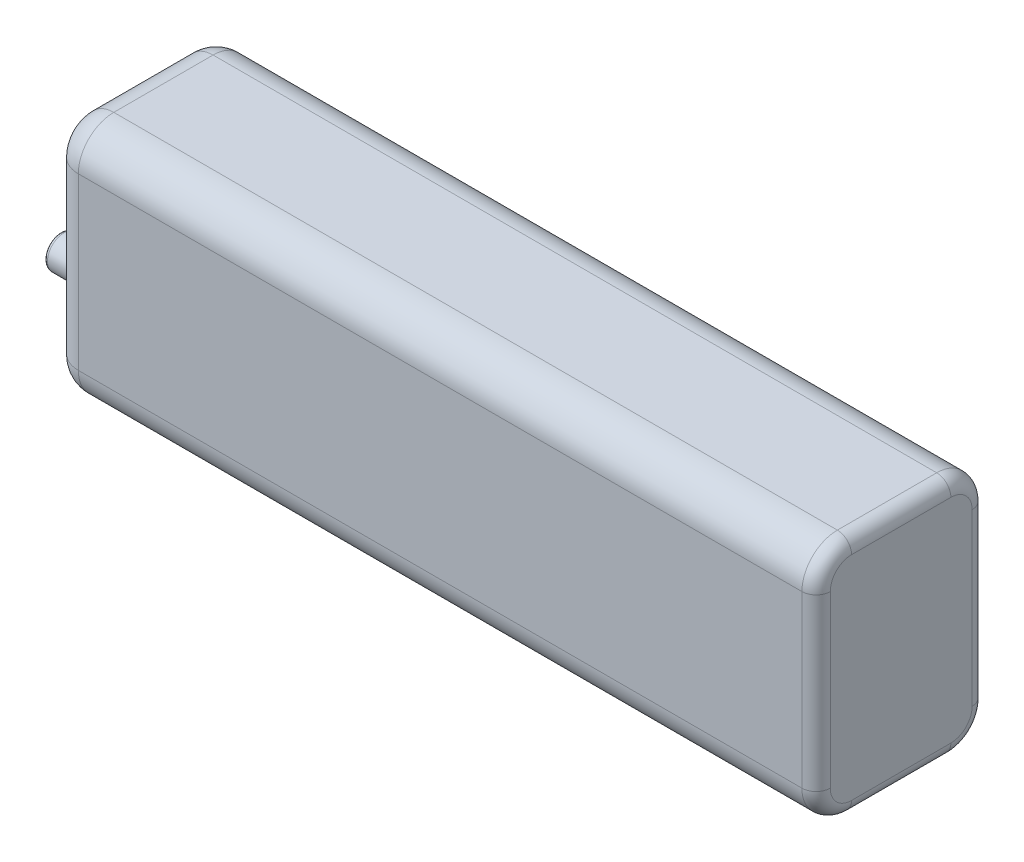
ISO-10303-21;
HEADER;
FILE_DESCRIPTION(('STEP AP214'),'2;1');
FILE_NAME('part.step','',(''),(''),'','','');
FILE_SCHEMA(('AUTOMOTIVE_DESIGN { 1 0 10303 214 1 1 1 1 }'));
ENDSEC;
DATA;
#1=APPLICATION_CONTEXT('core data for automotive mechanical design processes');
#2=APPLICATION_PROTOCOL_DEFINITION('international standard','automotive_design',2000,#1);
#3=PRODUCT_CONTEXT('',#1,'mechanical');
#4=PRODUCT('Part','Part','',(#3));
#5=PRODUCT_RELATED_PRODUCT_CATEGORY('part','',(#4));
#6=PRODUCT_DEFINITION_FORMATION('','',#4);
#7=PRODUCT_DEFINITION_CONTEXT('part definition',#1,'design');
#8=PRODUCT_DEFINITION('design','',#6,#7);
#9=PRODUCT_DEFINITION_SHAPE('','',#8);
#10=(LENGTH_UNIT() NAMED_UNIT(*) SI_UNIT(.MILLI.,.METRE.));
#11=(NAMED_UNIT(*) PLANE_ANGLE_UNIT() SI_UNIT($,.RADIAN.));
#12=(NAMED_UNIT(*) SI_UNIT($,.STERADIAN.) SOLID_ANGLE_UNIT());
#13=UNCERTAINTY_MEASURE_WITH_UNIT(LENGTH_MEASURE(1.E-05),#10,'distance_accuracy_value','');
#14=(GEOMETRIC_REPRESENTATION_CONTEXT(3) GLOBAL_UNCERTAINTY_ASSIGNED_CONTEXT((#13)) GLOBAL_UNIT_ASSIGNED_CONTEXT((#10,
#11,#12)) REPRESENTATION_CONTEXT('',''));
#15=CARTESIAN_POINT('',(0.,0.,0.));
#16=DIRECTION('',(0.,0.,1.));
#17=DIRECTION('',(1.,0.,0.));
#18=AXIS2_PLACEMENT_3D('',#15,#16,#17);
#19=CARTESIAN_POINT('',(-54.,17.,24.));
#20=DIRECTION('',(1.,0.,0.));
#21=DIRECTION('',(0.,1.,0.));
#22=AXIS2_PLACEMENT_3D('',#19,#20,#21);
#23=PLANE('',#22);
#24=DIRECTION('',(0.,-1.,0.));
#25=VECTOR('',#24,1.);
#26=CARTESIAN_POINT('',(-54.,12.,20.));
#27=LINE('',#26,#25);
#28=CARTESIAN_POINT('',(-54.,-12.,20.));
#29=VERTEX_POINT('',#28);
#30=CARTESIAN_POINT('',(-54.,12.,20.));
#31=VERTEX_POINT('',#30);
#32=EDGE_CURVE('E288',#29,#31,#27,.F.);
#33=ORIENTED_EDGE('',*,*,#32,.T.);
#34=CARTESIAN_POINT('',(-54.,12.,19.));
#35=DIRECTION('',(1.,0.,0.));
#36=DIRECTION('',(0.,1.,0.));
#37=AXIS2_PLACEMENT_3D('',#34,#35,#36);
#38=CIRCLE('',#37,1.);
#39=CARTESIAN_POINT('',(-54.,13.,19.));
#40=VERTEX_POINT('',#39);
#41=EDGE_CURVE('E312',#31,#40,#38,.F.);
#42=ORIENTED_EDGE('',*,*,#41,.T.);
#43=DIRECTION('',(0.,0.,-1.));
#44=VECTOR('',#43,1.);
#45=CARTESIAN_POINT('',(-54.,13.,24.));
#46=LINE('',#45,#44);
#47=CARTESIAN_POINT('',(-54.,13.,5.));
#48=VERTEX_POINT('',#47);
#49=EDGE_CURVE('E310',#40,#48,#46,.T.);
#50=ORIENTED_EDGE('',*,*,#49,.T.);
#51=CARTESIAN_POINT('',(-54.,12.,5.));
#52=DIRECTION('',(1.,0.,0.));
#53=DIRECTION('',(0.,1.,0.));
#54=AXIS2_PLACEMENT_3D('',#51,#52,#53);
#55=CIRCLE('',#54,1.);
#56=CARTESIAN_POINT('',(-54.,12.,4.));
#57=VERTEX_POINT('',#56);
#58=EDGE_CURVE('E308',#48,#57,#55,.F.);
#59=ORIENTED_EDGE('',*,*,#58,.T.);
#60=DIRECTION('',(0.,-1.,0.));
#61=VECTOR('',#60,1.);
#62=CARTESIAN_POINT('',(-54.,17.,4.));
#63=LINE('',#62,#61);
#64=CARTESIAN_POINT('',(-54.,-12.,4.));
#65=VERTEX_POINT('',#64);
#66=EDGE_CURVE('E306',#57,#65,#63,.T.);
#67=ORIENTED_EDGE('',*,*,#66,.T.);
#68=CARTESIAN_POINT('',(-54.,-12.,5.));
#69=DIRECTION('',(1.,0.,0.));
#70=DIRECTION('',(0.,1.,0.));
#71=AXIS2_PLACEMENT_3D('',#68,#69,#70);
#72=CIRCLE('',#71,1.);
#73=CARTESIAN_POINT('',(-54.,-13.,5.));
#74=VERTEX_POINT('',#73);
#75=EDGE_CURVE('E304',#65,#74,#72,.F.);
#76=ORIENTED_EDGE('',*,*,#75,.T.);
#77=DIRECTION('',(0.,0.,-1.));
#78=VECTOR('',#77,1.);
#79=CARTESIAN_POINT('',(-54.,-13.,24.));
#80=LINE('',#79,#78);
#81=CARTESIAN_POINT('',(-54.,-13.,19.));
#82=VERTEX_POINT('',#81);
#83=EDGE_CURVE('E302',#74,#82,#80,.F.);
#84=ORIENTED_EDGE('',*,*,#83,.T.);
#85=CARTESIAN_POINT('',(-54.,-12.,19.));
#86=DIRECTION('',(1.,0.,0.));
#87=DIRECTION('',(0.,1.,0.));
#88=AXIS2_PLACEMENT_3D('',#85,#86,#87);
#89=CIRCLE('',#88,1.);
#90=EDGE_CURVE('E300',#82,#29,#89,.F.);
#91=ORIENTED_EDGE('',*,*,#90,.T.);
#92=EDGE_LOOP('',(#33,#42,#50,#59,#67,#76,#84,#91));
#93=FACE_BOUND('',#92,.T.);
#94=DIRECTION('',(0.,1.,0.));
#95=VECTOR('',#94,1.);
#96=CARTESIAN_POINT('',(-54.,-3.71623294333291,17.6228811895128));
#97=LINE('',#96,#95);
#98=CARTESIAN_POINT('',(-54.,-12.0863039057049,17.6228811895128));
#99=VERTEX_POINT('',#98);
#100=CARTESIAN_POINT('',(-54.,-3.71623294333291,17.6228811895128));
#101=VERTEX_POINT('',#100);
#102=EDGE_CURVE('E201',#99,#101,#97,.T.);
#103=ORIENTED_EDGE('',*,*,#102,.F.);
#104=DIRECTION('',(0.,0.,1.));
#105=VECTOR('',#104,1.);
#106=CARTESIAN_POINT('',(-54.,-12.0863039057049,17.6228811895128));
#107=LINE('',#106,#105);
#108=CARTESIAN_POINT('',(-54.,-12.0863039057049,5.6695768500166));
#109=VERTEX_POINT('',#108);
#110=EDGE_CURVE('E208',#109,#99,#107,.T.);
#111=ORIENTED_EDGE('',*,*,#110,.F.);
#112=DIRECTION('',(0.,-1.,0.));
#113=VECTOR('',#112,1.);
#114=CARTESIAN_POINT('',(-54.,-3.71623294333291,5.6695768500166));
#115=LINE('',#114,#113);
#116=CARTESIAN_POINT('',(-54.,-3.71623294333291,5.6695768500166));
#117=VERTEX_POINT('',#116);
#118=EDGE_CURVE('E221',#117,#109,#115,.T.);
#119=ORIENTED_EDGE('',*,*,#118,.F.);
#120=DIRECTION('',(0.,0.,-1.));
#121=VECTOR('',#120,1.);
#122=CARTESIAN_POINT('',(-54.,-3.71623294333291,17.6228811895128));
#123=LINE('',#122,#121);
#124=EDGE_CURVE('E216',#101,#117,#123,.T.);
#125=ORIENTED_EDGE('',*,*,#124,.F.);
#126=EDGE_LOOP('',(#103,#111,#119,#125));
#127=FACE_BOUND('',#126,.T.);
#128=ADVANCED_FACE('F41',(#93,#127),#23,.F.);
#129=CARTESIAN_POINT('',(54.,17.,24.));
#130=DIRECTION('',(-1.,0.,0.));
#131=DIRECTION('',(0.,-1.,0.));
#132=AXIS2_PLACEMENT_3D('',#129,#130,#131);
#133=PLANE('',#132);
#134=DIRECTION('',(0.,1.,0.));
#135=VECTOR('',#134,1.);
#136=CARTESIAN_POINT('',(54.,-12.,22.));
#137=LINE('',#136,#135);
#138=CARTESIAN_POINT('',(54.,12.,22.));
#139=VERTEX_POINT('',#138);
#140=CARTESIAN_POINT('',(54.,-12.,22.));
#141=VERTEX_POINT('',#140);
#142=EDGE_CURVE('E335',#139,#141,#137,.F.);
#143=ORIENTED_EDGE('',*,*,#142,.T.);
#144=CARTESIAN_POINT('',(54.,-12.,19.));
#145=DIRECTION('',(-1.,0.,0.));
#146=DIRECTION('',(0.,-1.,0.));
#147=AXIS2_PLACEMENT_3D('',#144,#145,#146);
#148=CIRCLE('',#147,3.);
#149=CARTESIAN_POINT('',(54.,-15.,19.));
#150=VERTEX_POINT('',#149);
#151=EDGE_CURVE('E371',#141,#150,#148,.F.);
#152=ORIENTED_EDGE('',*,*,#151,.T.);
#153=DIRECTION('',(0.,0.,-1.));
#154=VECTOR('',#153,1.);
#155=CARTESIAN_POINT('',(54.,-15.,24.));
#156=LINE('',#155,#154);
#157=CARTESIAN_POINT('',(54.,-15.,5.));
#158=VERTEX_POINT('',#157);
#159=EDGE_CURVE('E369',#150,#158,#156,.T.);
#160=ORIENTED_EDGE('',*,*,#159,.T.);
#161=CARTESIAN_POINT('',(54.,-12.,5.));
#162=DIRECTION('',(-1.,0.,0.));
#163=DIRECTION('',(0.,-1.,0.));
#164=AXIS2_PLACEMENT_3D('',#161,#162,#163);
#165=CIRCLE('',#164,3.);
#166=CARTESIAN_POINT('',(54.,-12.,2.));
#167=VERTEX_POINT('',#166);
#168=EDGE_CURVE('E367',#158,#167,#165,.F.);
#169=ORIENTED_EDGE('',*,*,#168,.T.);
#170=DIRECTION('',(0.,1.,0.));
#171=VECTOR('',#170,1.);
#172=CARTESIAN_POINT('',(54.,17.,2.));
#173=LINE('',#172,#171);
#174=CARTESIAN_POINT('',(54.,12.,2.));
#175=VERTEX_POINT('',#174);
#176=EDGE_CURVE('E365',#167,#175,#173,.T.);
#177=ORIENTED_EDGE('',*,*,#176,.T.);
#178=CARTESIAN_POINT('',(54.,12.,5.));
#179=DIRECTION('',(-1.,0.,0.));
#180=DIRECTION('',(0.,-1.,0.));
#181=AXIS2_PLACEMENT_3D('',#178,#179,#180);
#182=CIRCLE('',#181,3.);
#183=CARTESIAN_POINT('',(54.,15.,5.));
#184=VERTEX_POINT('',#183);
#185=EDGE_CURVE('E363',#175,#184,#182,.F.);
#186=ORIENTED_EDGE('',*,*,#185,.T.);
#187=DIRECTION('',(0.,0.,-1.));
#188=VECTOR('',#187,1.);
#189=CARTESIAN_POINT('',(54.,15.,24.));
#190=LINE('',#189,#188);
#191=CARTESIAN_POINT('',(54.,15.,19.));
#192=VERTEX_POINT('',#191);
#193=EDGE_CURVE('E361',#184,#192,#190,.F.);
#194=ORIENTED_EDGE('',*,*,#193,.T.);
#195=CARTESIAN_POINT('',(54.,12.,19.));
#196=DIRECTION('',(-1.,0.,0.));
#197=DIRECTION('',(0.,-1.,0.));
#198=AXIS2_PLACEMENT_3D('',#195,#196,#197);
#199=CIRCLE('',#198,3.);
#200=EDGE_CURVE('E359',#192,#139,#199,.F.);
#201=ORIENTED_EDGE('',*,*,#200,.T.);
#202=EDGE_LOOP('',(#143,#152,#160,#169,#177,#186,#194,#201));
#203=FACE_BOUND('',#202,.T.);
#204=ADVANCED_FACE('F484',(#203),#133,.F.);
#205=CARTESIAN_POINT('',(-54.,17.,24.));
#206=DIRECTION('',(0.,-1.,0.));
#207=DIRECTION('',(0.,0.,-1.));
#208=AXIS2_PLACEMENT_3D('',#205,#206,#207);
#209=PLANE('',#208);
#210=DIRECTION('',(-1.,0.,0.));
#211=VECTOR('',#210,1.);
#212=CARTESIAN_POINT('',(54.,17.,19.));
#213=LINE('',#212,#211);
#214=CARTESIAN_POINT('',(-50.,17.,19.));
#215=VERTEX_POINT('',#214);
#216=CARTESIAN_POINT('',(52.,17.,19.));
#217=VERTEX_POINT('',#216);
#218=EDGE_CURVE('E231',#215,#217,#213,.F.);
#219=ORIENTED_EDGE('',*,*,#218,.T.);
#220=DIRECTION('',(0.,0.,-1.));
#221=VECTOR('',#220,1.);
#222=CARTESIAN_POINT('',(52.,17.,24.));
#223=LINE('',#222,#221);
#224=CARTESIAN_POINT('',(52.,17.,5.));
#225=VERTEX_POINT('',#224);
#226=EDGE_CURVE('E385',#217,#225,#223,.T.);
#227=ORIENTED_EDGE('',*,*,#226,.T.);
#228=DIRECTION('',(-1.,0.,0.));
#229=VECTOR('',#228,1.);
#230=CARTESIAN_POINT('',(-54.,17.,5.));
#231=LINE('',#230,#229);
#232=CARTESIAN_POINT('',(-50.,17.,5.));
#233=VERTEX_POINT('',#232);
#234=EDGE_CURVE('E233',#225,#233,#231,.T.);
#235=ORIENTED_EDGE('',*,*,#234,.T.);
#236=DIRECTION('',(0.,0.,-1.));
#237=VECTOR('',#236,1.);
#238=CARTESIAN_POINT('',(-50.,17.,24.));
#239=LINE('',#238,#237);
#240=EDGE_CURVE('E318',#233,#215,#239,.F.);
#241=ORIENTED_EDGE('',*,*,#240,.T.);
#242=EDGE_LOOP('',(#219,#227,#235,#241));
#243=FACE_BOUND('',#242,.T.);
#244=ADVANCED_FACE('F443',(#243),#209,.F.);
#245=CARTESIAN_POINT('',(-54.,-17.,24.));
#246=DIRECTION('',(0.,1.,0.));
#247=DIRECTION('',(0.,0.,1.));
#248=AXIS2_PLACEMENT_3D('',#245,#246,#247);
#249=PLANE('',#248);
#250=DIRECTION('',(1.,0.,0.));
#251=VECTOR('',#250,1.);
#252=CARTESIAN_POINT('',(-54.,-17.,5.));
#253=LINE('',#252,#251);
#254=CARTESIAN_POINT('',(-50.,-17.,5.));
#255=VERTEX_POINT('',#254);
#256=CARTESIAN_POINT('',(52.,-17.,5.));
#257=VERTEX_POINT('',#256);
#258=EDGE_CURVE('E246',#255,#257,#253,.T.);
#259=ORIENTED_EDGE('',*,*,#258,.T.);
#260=DIRECTION('',(0.,0.,-1.));
#261=VECTOR('',#260,1.);
#262=CARTESIAN_POINT('',(52.,-17.,24.));
#263=LINE('',#262,#261);
#264=CARTESIAN_POINT('',(52.,-17.,19.));
#265=VERTEX_POINT('',#264);
#266=EDGE_CURVE('E377',#257,#265,#263,.F.);
#267=ORIENTED_EDGE('',*,*,#266,.T.);
#268=DIRECTION('',(1.,0.,0.));
#269=VECTOR('',#268,1.);
#270=CARTESIAN_POINT('',(-54.,-17.,19.));
#271=LINE('',#270,#269);
#272=CARTESIAN_POINT('',(-50.,-17.,19.));
#273=VERTEX_POINT('',#272);
#274=EDGE_CURVE('E244',#265,#273,#271,.F.);
#275=ORIENTED_EDGE('',*,*,#274,.T.);
#276=DIRECTION('',(0.,0.,-1.));
#277=VECTOR('',#276,1.);
#278=CARTESIAN_POINT('',(-50.,-17.,24.));
#279=LINE('',#278,#277);
#280=EDGE_CURVE('E328',#273,#255,#279,.T.);
#281=ORIENTED_EDGE('',*,*,#280,.T.);
#282=EDGE_LOOP('',(#259,#267,#275,#281));
#283=FACE_BOUND('',#282,.T.);
#284=ADVANCED_FACE('F473',(#283),#249,.F.);
#285=CARTESIAN_POINT('',(0.,0.,24.));
#286=DIRECTION('',(0.,0.,1.));
#287=DIRECTION('',(1.,0.,0.));
#288=AXIS2_PLACEMENT_3D('',#285,#286,#287);
#289=PLANE('',#288);
#290=DIRECTION('',(1.,0.,0.));
#291=VECTOR('',#290,1.);
#292=CARTESIAN_POINT('',(54.,-12.,24.));
#293=LINE('',#292,#291);
#294=CARTESIAN_POINT('',(-50.,-12.,24.));
#295=VERTEX_POINT('',#294);
#296=CARTESIAN_POINT('',(52.,-12.,24.));
#297=VERTEX_POINT('',#296);
#298=EDGE_CURVE('E240',#295,#297,#293,.T.);
#299=ORIENTED_EDGE('',*,*,#298,.T.);
#300=DIRECTION('',(0.,1.,0.));
#301=VECTOR('',#300,1.);
#302=CARTESIAN_POINT('',(52.,12.,24.));
#303=LINE('',#302,#301);
#304=CARTESIAN_POINT('',(52.,12.,24.));
#305=VERTEX_POINT('',#304);
#306=EDGE_CURVE('E11',#297,#305,#303,.T.);
#307=ORIENTED_EDGE('',*,*,#306,.T.);
#308=DIRECTION('',(-1.,0.,0.));
#309=VECTOR('',#308,1.);
#310=CARTESIAN_POINT('',(-54.,12.,24.));
#311=LINE('',#310,#309);
#312=CARTESIAN_POINT('',(-50.,12.,24.));
#313=VERTEX_POINT('',#312);
#314=EDGE_CURVE('E242',#305,#313,#311,.T.);
#315=ORIENTED_EDGE('',*,*,#314,.T.);
#316=DIRECTION('',(0.,-1.,0.));
#317=VECTOR('',#316,1.);
#318=CARTESIAN_POINT('',(-50.,-12.,24.));
#319=LINE('',#318,#317);
#320=EDGE_CURVE('E333',#313,#295,#319,.T.);
#321=ORIENTED_EDGE('',*,*,#320,.T.);
#322=EDGE_LOOP('',(#299,#307,#315,#321));
#323=FACE_BOUND('',#322,.T.);
#324=ADVANCED_FACE('F456',(#323),#289,.T.);
#325=CARTESIAN_POINT('',(0.,0.,0.));
#326=DIRECTION('',(0.,0.,1.));
#327=DIRECTION('',(1.,0.,0.));
#328=AXIS2_PLACEMENT_3D('',#325,#326,#327);
#329=PLANE('',#328);
#330=DIRECTION('',(-1.,0.,0.));
#331=VECTOR('',#330,1.);
#332=CARTESIAN_POINT('',(0.,12.,0.));
#333=LINE('',#332,#331);
#334=CARTESIAN_POINT('',(-50.,12.,0.));
#335=VERTEX_POINT('',#334);
#336=CARTESIAN_POINT('',(52.,12.,0.));
#337=VERTEX_POINT('',#336);
#338=EDGE_CURVE('E237',#335,#337,#333,.F.);
#339=ORIENTED_EDGE('',*,*,#338,.T.);
#340=DIRECTION('',(0.,1.,0.));
#341=VECTOR('',#340,1.);
#342=CARTESIAN_POINT('',(52.,0.,0.));
#343=LINE('',#342,#341);
#344=CARTESIAN_POINT('',(52.,-12.,0.));
#345=VERTEX_POINT('',#344);
#346=EDGE_CURVE('E381',#337,#345,#343,.F.);
#347=ORIENTED_EDGE('',*,*,#346,.T.);
#348=DIRECTION('',(1.,0.,0.));
#349=VECTOR('',#348,1.);
#350=CARTESIAN_POINT('',(0.,-12.,0.));
#351=LINE('',#350,#349);
#352=CARTESIAN_POINT('',(-50.,-12.,0.));
#353=VERTEX_POINT('',#352);
#354=EDGE_CURVE('E235',#345,#353,#351,.F.);
#355=ORIENTED_EDGE('',*,*,#354,.T.);
#356=DIRECTION('',(0.,-1.,0.));
#357=VECTOR('',#356,1.);
#358=CARTESIAN_POINT('',(-50.,0.,0.));
#359=LINE('',#358,#357);
#360=EDGE_CURVE('E323',#353,#335,#359,.F.);
#361=ORIENTED_EDGE('',*,*,#360,.T.);
#362=EDGE_LOOP('',(#339,#347,#355,#361));
#363=FACE_BOUND('',#362,.T.);
#364=ADVANCED_FACE('F425',(#363),#329,.F.);
#365=CARTESIAN_POINT('',(-54.,12.,5.));
#366=DIRECTION('',(-1.,0.,0.));
#367=DIRECTION('',(0.,0.,1.));
#368=AXIS2_PLACEMENT_3D('',#365,#366,#367);
#369=CYLINDRICAL_SURFACE('',#368,5.);
#370=ORIENTED_EDGE('',*,*,#234,.F.);
#371=CARTESIAN_POINT('',(52.,12.,5.));
#372=DIRECTION('',(-1.,0.,0.));
#373=DIRECTION('',(0.,-1.,0.));
#374=AXIS2_PLACEMENT_3D('',#371,#372,#373);
#375=CIRCLE('',#374,5.);
#376=EDGE_CURVE('E383',#225,#337,#375,.T.);
#377=ORIENTED_EDGE('',*,*,#376,.T.);
#378=ORIENTED_EDGE('',*,*,#338,.F.);
#379=CARTESIAN_POINT('',(-50.,12.,5.));
#380=DIRECTION('',(1.,0.,0.));
#381=DIRECTION('',(0.,1.,0.));
#382=AXIS2_PLACEMENT_3D('',#379,#380,#381);
#383=CIRCLE('',#382,5.);
#384=EDGE_CURVE('E320',#335,#233,#383,.T.);
#385=ORIENTED_EDGE('',*,*,#384,.T.);
#386=EDGE_LOOP('',(#370,#377,#378,#385));
#387=FACE_BOUND('',#386,.T.);
#388=ADVANCED_FACE('F422',(#387),#369,.T.);
#389=CARTESIAN_POINT('',(0.,12.,19.));
#390=DIRECTION('',(1.,0.,0.));
#391=DIRECTION('',(0.,0.,-1.));
#392=AXIS2_PLACEMENT_3D('',#389,#390,#391);
#393=CYLINDRICAL_SURFACE('',#392,5.);
#394=ORIENTED_EDGE('',*,*,#314,.F.);
#395=CARTESIAN_POINT('',(52.,12.,19.));
#396=DIRECTION('',(-1.,0.,0.));
#397=DIRECTION('',(0.,-1.,0.));
#398=AXIS2_PLACEMENT_3D('',#395,#396,#397);
#399=CIRCLE('',#398,5.);
#400=EDGE_CURVE('E50',#305,#217,#399,.T.);
#401=ORIENTED_EDGE('',*,*,#400,.T.);
#402=ORIENTED_EDGE('',*,*,#218,.F.);
#403=CARTESIAN_POINT('',(-50.,12.,19.));
#404=DIRECTION('',(1.,0.,0.));
#405=DIRECTION('',(0.,1.,0.));
#406=AXIS2_PLACEMENT_3D('',#403,#404,#405);
#407=CIRCLE('',#406,5.);
#408=EDGE_CURVE('E315',#215,#313,#407,.T.);
#409=ORIENTED_EDGE('',*,*,#408,.T.);
#410=EDGE_LOOP('',(#394,#401,#402,#409));
#411=FACE_BOUND('',#410,.T.);
#412=ADVANCED_FACE('F445',(#411),#393,.T.);
#413=CARTESIAN_POINT('',(-54.,-12.,5.));
#414=DIRECTION('',(1.,0.,0.));
#415=DIRECTION('',(0.,0.,-1.));
#416=AXIS2_PLACEMENT_3D('',#413,#414,#415);
#417=CYLINDRICAL_SURFACE('',#416,5.);
#418=ORIENTED_EDGE('',*,*,#354,.F.);
#419=CARTESIAN_POINT('',(52.,-12.,5.));
#420=DIRECTION('',(-1.,0.,0.));
#421=DIRECTION('',(0.,-1.,0.));
#422=AXIS2_PLACEMENT_3D('',#419,#420,#421);
#423=CIRCLE('',#422,5.);
#424=EDGE_CURVE('E379',#345,#257,#423,.T.);
#425=ORIENTED_EDGE('',*,*,#424,.T.);
#426=ORIENTED_EDGE('',*,*,#258,.F.);
#427=CARTESIAN_POINT('',(-50.,-12.,5.));
#428=DIRECTION('',(1.,0.,0.));
#429=DIRECTION('',(0.,1.,0.));
#430=AXIS2_PLACEMENT_3D('',#427,#428,#429);
#431=CIRCLE('',#430,5.);
#432=EDGE_CURVE('E325',#255,#353,#431,.T.);
#433=ORIENTED_EDGE('',*,*,#432,.T.);
#434=EDGE_LOOP('',(#418,#425,#426,#433));
#435=FACE_BOUND('',#434,.T.);
#436=ADVANCED_FACE('F477',(#435),#417,.T.);
#437=CARTESIAN_POINT('',(0.,-12.,19.));
#438=DIRECTION('',(-1.,0.,0.));
#439=DIRECTION('',(0.,0.,1.));
#440=AXIS2_PLACEMENT_3D('',#437,#438,#439);
#441=CYLINDRICAL_SURFACE('',#440,5.);
#442=ORIENTED_EDGE('',*,*,#274,.F.);
#443=CARTESIAN_POINT('',(52.,-12.,19.));
#444=DIRECTION('',(-1.,0.,0.));
#445=DIRECTION('',(0.,-1.,0.));
#446=AXIS2_PLACEMENT_3D('',#443,#444,#445);
#447=CIRCLE('',#446,5.);
#448=EDGE_CURVE('E374',#265,#297,#447,.T.);
#449=ORIENTED_EDGE('',*,*,#448,.T.);
#450=ORIENTED_EDGE('',*,*,#298,.F.);
#451=CARTESIAN_POINT('',(-50.,-12.,19.));
#452=DIRECTION('',(1.,0.,0.));
#453=DIRECTION('',(0.,1.,0.));
#454=AXIS2_PLACEMENT_3D('',#451,#452,#453);
#455=CIRCLE('',#454,5.);
#456=EDGE_CURVE('E330',#295,#273,#455,.T.);
#457=ORIENTED_EDGE('',*,*,#456,.T.);
#458=EDGE_LOOP('',(#442,#449,#450,#457));
#459=FACE_BOUND('',#458,.T.);
#460=ADVANCED_FACE('F460',(#459),#441,.T.);
#461=CARTESIAN_POINT('',(-57.,-3.71623294333291,17.6228811895128));
#462=DIRECTION('',(0.,0.,-1.));
#463=DIRECTION('',(-1.,0.,0.));
#464=AXIS2_PLACEMENT_3D('',#461,#462,#463);
#465=PLANE('',#464);
#466=DIRECTION('',(1.,0.,0.));
#467=VECTOR('',#466,1.);
#468=CARTESIAN_POINT('',(-57.,-3.71623294333291,17.6228811895128));
#469=LINE('',#468,#467);
#470=CARTESIAN_POINT('',(-56.,-3.71623294333291,17.6228811895128));
#471=VERTEX_POINT('',#470);
#472=EDGE_CURVE('E229',#471,#101,#469,.T.);
#473=ORIENTED_EDGE('',*,*,#472,.F.);
#474=DIRECTION('',(0.,-1.,0.));
#475=VECTOR('',#474,1.);
#476=CARTESIAN_POINT('',(-56.,-3.71623294333291,17.6228811895128));
#477=LINE('',#476,#475);
#478=CARTESIAN_POINT('',(-56.,-12.0863039057049,17.6228811895128));
#479=VERTEX_POINT('',#478);
#480=EDGE_CURVE('E203',#471,#479,#477,.T.);
#481=ORIENTED_EDGE('',*,*,#480,.T.);
#482=DIRECTION('',(1.,0.,0.));
#483=VECTOR('',#482,1.);
#484=CARTESIAN_POINT('',(-57.,-12.0863039057049,17.6228811895128));
#485=LINE('',#484,#483);
#486=EDGE_CURVE('E197',#479,#99,#485,.T.);
#487=ORIENTED_EDGE('',*,*,#486,.T.);
#488=ORIENTED_EDGE('',*,*,#102,.T.);
#489=EDGE_LOOP('',(#473,#481,#487,#488));
#490=FACE_BOUND('',#489,.T.);
#491=ADVANCED_FACE('F200',(#490),#465,.F.);
#492=CARTESIAN_POINT('',(-57.,-3.71623294333291,17.6228811895128));
#493=DIRECTION('',(0.,-1.,0.));
#494=DIRECTION('',(1.,0.,0.));
#495=AXIS2_PLACEMENT_3D('',#492,#493,#494);
#496=PLANE('',#495);
#497=DIRECTION('',(1.,0.,0.));
#498=VECTOR('',#497,1.);
#499=CARTESIAN_POINT('',(-57.,-3.71623294333291,5.6695768500166));
#500=LINE('',#499,#498);
#501=CARTESIAN_POINT('',(-56.,-3.71623294333291,5.6695768500166));
#502=VERTEX_POINT('',#501);
#503=EDGE_CURVE('E227',#502,#117,#500,.T.);
#504=ORIENTED_EDGE('',*,*,#503,.F.);
#505=DIRECTION('',(0.,0.,1.));
#506=VECTOR('',#505,1.);
#507=CARTESIAN_POINT('',(-56.,-3.71623294333291,17.6228811895128));
#508=LINE('',#507,#506);
#509=EDGE_CURVE('E278',#502,#471,#508,.T.);
#510=ORIENTED_EDGE('',*,*,#509,.T.);
#511=ORIENTED_EDGE('',*,*,#472,.T.);
#512=ORIENTED_EDGE('',*,*,#124,.T.);
#513=EDGE_LOOP('',(#504,#510,#511,#512));
#514=FACE_BOUND('',#513,.T.);
#515=ADVANCED_FACE('F684',(#514),#496,.F.);
#516=CARTESIAN_POINT('',(-57.,-3.71623294333291,5.6695768500166));
#517=DIRECTION('',(0.,0.,1.));
#518=DIRECTION('',(0.,-1.,0.));
#519=AXIS2_PLACEMENT_3D('',#516,#517,#518);
#520=PLANE('',#519);
#521=DIRECTION('',(1.,0.,0.));
#522=VECTOR('',#521,1.);
#523=CARTESIAN_POINT('',(-57.,-12.0863039057049,5.6695768500166));
#524=LINE('',#523,#522);
#525=CARTESIAN_POINT('',(-56.,-12.0863039057049,5.6695768500166));
#526=VERTEX_POINT('',#525);
#527=EDGE_CURVE('E207',#526,#109,#524,.T.);
#528=ORIENTED_EDGE('',*,*,#527,.F.);
#529=DIRECTION('',(0.,1.,0.));
#530=VECTOR('',#529,1.);
#531=CARTESIAN_POINT('',(-56.,-3.71623294333291,5.6695768500166));
#532=LINE('',#531,#530);
#533=EDGE_CURVE('E281',#526,#502,#532,.T.);
#534=ORIENTED_EDGE('',*,*,#533,.T.);
#535=ORIENTED_EDGE('',*,*,#503,.T.);
#536=ORIENTED_EDGE('',*,*,#118,.T.);
#537=EDGE_LOOP('',(#528,#534,#535,#536));
#538=FACE_BOUND('',#537,.T.);
#539=ADVANCED_FACE('F677',(#538),#520,.F.);
#540=CARTESIAN_POINT('',(-57.,-12.0863039057049,17.6228811895128));
#541=DIRECTION('',(0.,1.,0.));
#542=DIRECTION('',(-1.,0.,0.));
#543=AXIS2_PLACEMENT_3D('',#540,#541,#542);
#544=PLANE('',#543);
#545=ORIENTED_EDGE('',*,*,#486,.F.);
#546=DIRECTION('',(0.,0.,-1.));
#547=VECTOR('',#546,1.);
#548=CARTESIAN_POINT('',(-56.,-12.0863039057049,17.6228811895128));
#549=LINE('',#548,#547);
#550=EDGE_CURVE('E283',#479,#526,#549,.T.);
#551=ORIENTED_EDGE('',*,*,#550,.T.);
#552=ORIENTED_EDGE('',*,*,#527,.T.);
#553=ORIENTED_EDGE('',*,*,#110,.T.);
#554=EDGE_LOOP('',(#545,#551,#552,#553));
#555=FACE_BOUND('',#554,.T.);
#556=ADVANCED_FACE('F219',(#555),#544,.F.);
#557=CARTESIAN_POINT('',(-57.,0.,0.));
#558=DIRECTION('',(1.,0.,0.));
#559=DIRECTION('',(0.,0.,-1.));
#560=AXIS2_PLACEMENT_3D('',#557,#558,#559);
#561=PLANE('',#560);
#562=CARTESIAN_POINT('',(-57.,-8.03150117411007,9.05036894538525));
#563=DIRECTION('',(1.,0.,0.));
#564=DIRECTION('',(0.,0.,-1.));
#565=AXIS2_PLACEMENT_3D('',#562,#563,#564);
#566=CIRCLE('',#565,2.33169499833651);
#567=CARTESIAN_POINT('',(-57.,-8.03150117411007,6.71867394704874));
#568=VERTEX_POINT('',#567);
#569=EDGE_CURVE('E252',#568,#568,#566,.F.);
#570=ORIENTED_EDGE('',*,*,#569,.F.);
#571=EDGE_LOOP('',(#570));
#572=FACE_BOUND('',#571,.T.);
#573=DIRECTION('',(0.,0.,1.));
#574=VECTOR('',#573,1.);
#575=CARTESIAN_POINT('',(-57.,-11.0863039057049,0.));
#576=LINE('',#575,#574);
#577=CARTESIAN_POINT('',(-57.,-11.0863039057049,6.66957685001662));
#578=VERTEX_POINT('',#577);
#579=CARTESIAN_POINT('',(-57.,-11.0863039057049,16.6228811895127));
#580=VERTEX_POINT('',#579);
#581=EDGE_CURVE('E274',#578,#580,#576,.T.);
#582=ORIENTED_EDGE('',*,*,#581,.T.);
#583=DIRECTION('',(0.,1.,0.));
#584=VECTOR('',#583,1.);
#585=CARTESIAN_POINT('',(-57.,0.,16.6228811895127));
#586=LINE('',#585,#584);
#587=CARTESIAN_POINT('',(-57.,-9.03494394190627,16.6228811895127));
#588=VERTEX_POINT('',#587);
#589=EDGE_CURVE('E276',#580,#588,#586,.T.);
#590=ORIENTED_EDGE('',*,*,#589,.T.);
#591=CARTESIAN_POINT('',(-57.,-8.03150117411007,14.5181474350856));
#592=DIRECTION('',(1.,0.,0.));
#593=DIRECTION('',(0.,0.,-1.));
#594=AXIS2_PLACEMENT_3D('',#591,#592,#593);
#595=CIRCLE('',#594,2.33169499833651);
#596=CARTESIAN_POINT('',(-57.,-7.02805840631387,16.6228811895127));
#597=VERTEX_POINT('',#596);
#598=EDGE_CURVE('E249',#597,#588,#595,.F.);
#599=ORIENTED_EDGE('',*,*,#598,.F.);
#600=DIRECTION('',(0.,1.,0.));
#601=VECTOR('',#600,1.);
#602=CARTESIAN_POINT('',(-57.,0.,16.6228811895127));
#603=LINE('',#602,#601);
#604=CARTESIAN_POINT('',(-57.,-4.71623294333293,16.6228811895127));
#605=VERTEX_POINT('',#604);
#606=EDGE_CURVE('E267',#597,#605,#603,.T.);
#607=ORIENTED_EDGE('',*,*,#606,.T.);
#608=DIRECTION('',(0.,0.,-1.));
#609=VECTOR('',#608,1.);
#610=CARTESIAN_POINT('',(-57.,-4.71623294333293,0.));
#611=LINE('',#610,#609);
#612=CARTESIAN_POINT('',(-57.,-4.71623294333293,6.66957685001662));
#613=VERTEX_POINT('',#612);
#614=EDGE_CURVE('E269',#605,#613,#611,.T.);
#615=ORIENTED_EDGE('',*,*,#614,.T.);
#616=DIRECTION('',(0.,-1.,0.));
#617=VECTOR('',#616,1.);
#618=CARTESIAN_POINT('',(-57.,0.,6.66957685001662));
#619=LINE('',#618,#617);
#620=EDGE_CURVE('E272',#613,#578,#619,.T.);
#621=ORIENTED_EDGE('',*,*,#620,.T.);
#622=EDGE_LOOP('',(#582,#590,#599,#607,#615,#621));
#623=FACE_BOUND('',#622,.T.);
#624=ADVANCED_FACE('F662',(#572,#623),#561,.F.);
#625=CARTESIAN_POINT('',(-62.,-8.03150117411007,14.5181474350856));
#626=DIRECTION('',(1.,0.,0.));
#627=DIRECTION('',(0.,1.,0.));
#628=AXIS2_PLACEMENT_3D('',#625,#626,#627);
#629=CYLINDRICAL_SURFACE('',#628,2.33169499833651);
#630=CARTESIAN_POINT('',(-61.5,-8.03150117411007,14.5181474350856));
#631=DIRECTION('',(-1.,0.,0.));
#632=DIRECTION('',(0.,-1.,0.));
#633=AXIS2_PLACEMENT_3D('',#630,#631,#632);
#634=CIRCLE('',#633,2.33169499833651);
#635=CARTESIAN_POINT('',(-61.5,-10.3631961724466,14.5181474350856));
#636=VERTEX_POINT('',#635);
#637=EDGE_CURVE('E264',#636,#636,#634,.F.);
#638=ORIENTED_EDGE('',*,*,#637,.T.);
#639=EDGE_LOOP('',(#638));
#640=FACE_BOUND('',#639,.T.);
#641=ORIENTED_EDGE('',*,*,#598,.T.);
#642=CARTESIAN_POINT('',(-59.1047337544271,-8.03150117411007,14.5181474350856));
#643=DIRECTION('',(0.707106781186551,0.,-0.707106781186544));
#644=DIRECTION('',(0.707106781186544,0.,0.707106781186551));
#645=AXIS2_PLACEMENT_3D('',#642,#643,#644);
#646=ELLIPSE('',#645,3.29751468996498,2.33169499833651);
#647=EDGE_CURVE('E286',#588,#597,#646,.F.);
#648=ORIENTED_EDGE('',*,*,#647,.T.);
#649=EDGE_LOOP('',(#641,#648));
#650=FACE_BOUND('',#649,.T.);
#651=ADVANCED_FACE('F655',(#640,#650),#629,.T.);
#652=CARTESIAN_POINT('',(-62.,-8.03150117411007,14.5181474350856));
#653=DIRECTION('',(-1.,0.,0.));
#654=DIRECTION('',(0.,-1.,0.));
#655=AXIS2_PLACEMENT_3D('',#652,#653,#654);
#656=PLANE('',#655);
#657=CARTESIAN_POINT('',(-62.,-8.03150117411007,14.5181474350856));
#658=DIRECTION('',(-1.,0.,0.));
#659=DIRECTION('',(0.,-1.,0.));
#660=AXIS2_PLACEMENT_3D('',#657,#658,#659);
#661=CIRCLE('',#660,1.83169499833651);
#662=CARTESIAN_POINT('',(-62.,-9.86319617244657,14.5181474350856));
#663=VERTEX_POINT('',#662);
#664=EDGE_CURVE('E261',#663,#663,#661,.T.);
#665=ORIENTED_EDGE('',*,*,#664,.T.);
#666=EDGE_LOOP('',(#665));
#667=FACE_BOUND('',#666,.T.);
#668=ADVANCED_FACE('F647',(#667),#656,.T.);
#669=CARTESIAN_POINT('',(-62.,-8.03150117411007,9.05036894538525));
#670=DIRECTION('',(1.,0.,0.));
#671=DIRECTION('',(0.,1.,0.));
#672=AXIS2_PLACEMENT_3D('',#669,#670,#671);
#673=CYLINDRICAL_SURFACE('',#672,2.33169499833651);
#674=CARTESIAN_POINT('',(-61.5,-8.03150117411007,9.05036894538525));
#675=DIRECTION('',(-1.,0.,0.));
#676=DIRECTION('',(0.,-1.,0.));
#677=AXIS2_PLACEMENT_3D('',#674,#675,#676);
#678=CIRCLE('',#677,2.33169499833651);
#679=CARTESIAN_POINT('',(-61.5,-10.3631961724466,9.05036894538525));
#680=VERTEX_POINT('',#679);
#681=EDGE_CURVE('E258',#680,#680,#678,.F.);
#682=ORIENTED_EDGE('',*,*,#681,.T.);
#683=EDGE_LOOP('',(#682));
#684=FACE_BOUND('',#683,.T.);
#685=ORIENTED_EDGE('',*,*,#569,.T.);
#686=EDGE_LOOP('',(#685));
#687=FACE_BOUND('',#686,.T.);
#688=ADVANCED_FACE('F639',(#684,#687),#673,.T.);
#689=CARTESIAN_POINT('',(-62.,-8.03150117411007,9.05036894538525));
#690=DIRECTION('',(-1.,0.,0.));
#691=DIRECTION('',(0.,-1.,0.));
#692=AXIS2_PLACEMENT_3D('',#689,#690,#691);
#693=PLANE('',#692);
#694=CARTESIAN_POINT('',(-62.,-8.03150117411007,9.05036894538525));
#695=DIRECTION('',(-1.,0.,0.));
#696=DIRECTION('',(0.,-1.,0.));
#697=AXIS2_PLACEMENT_3D('',#694,#695,#696);
#698=CIRCLE('',#697,1.83169499833651);
#699=CARTESIAN_POINT('',(-62.,-9.86319617244657,9.05036894538525));
#700=VERTEX_POINT('',#699);
#701=EDGE_CURVE('E255',#700,#700,#698,.T.);
#702=ORIENTED_EDGE('',*,*,#701,.T.);
#703=EDGE_LOOP('',(#702));
#704=FACE_BOUND('',#703,.T.);
#705=ADVANCED_FACE('F508',(#704),#693,.T.);
#706=CARTESIAN_POINT('',(-61.5,-8.03150117411007,9.05036894538525));
#707=DIRECTION('',(-1.,0.,0.));
#708=DIRECTION('',(0.,-1.,0.));
#709=AXIS2_PLACEMENT_3D('',#706,#707,#708);
#710=TOROIDAL_SURFACE('',#709,1.83169499833651,0.5);
#711=ORIENTED_EDGE('',*,*,#681,.F.);
#712=EDGE_LOOP('',(#711));
#713=FACE_BOUND('',#712,.T.);
#714=ORIENTED_EDGE('',*,*,#701,.F.);
#715=EDGE_LOOP('',(#714));
#716=FACE_BOUND('',#715,.T.);
#717=ADVANCED_FACE('F504',(#713,#716),#710,.T.);
#718=CARTESIAN_POINT('',(-61.5,-8.03150117411007,14.5181474350856));
#719=DIRECTION('',(-1.,0.,0.));
#720=DIRECTION('',(0.,-1.,0.));
#721=AXIS2_PLACEMENT_3D('',#718,#719,#720);
#722=TOROIDAL_SURFACE('',#721,1.83169499833651,0.5);
#723=ORIENTED_EDGE('',*,*,#637,.F.);
#724=EDGE_LOOP('',(#723));
#725=FACE_BOUND('',#724,.T.);
#726=ORIENTED_EDGE('',*,*,#664,.F.);
#727=EDGE_LOOP('',(#726));
#728=FACE_BOUND('',#727,.T.);
#729=ADVANCED_FACE('F507',(#725,#728),#722,.T.);
#730=CARTESIAN_POINT('',(-57.,-11.0863039057049,0.));
#731=DIRECTION('',(0.707106781186551,0.707106781186544,0.));
#732=DIRECTION('',(0.,0.,1.));
#733=AXIS2_PLACEMENT_3D('',#730,#731,#732);
#734=PLANE('',#733);
#735=DIRECTION('',(0.577350269189622,-0.577350269189628,-0.577350269189627));
#736=VECTOR('',#735,1.);
#737=CARTESIAN_POINT('',(-54.7768077166611,-13.3094961890438,4.44638456667773));
#738=LINE('',#737,#736);
#739=EDGE_CURVE('E294',#526,#578,#738,.F.);
#740=ORIENTED_EDGE('',*,*,#739,.F.);
#741=ORIENTED_EDGE('',*,*,#550,.F.);
#742=DIRECTION('',(0.577350269189622,-0.577350269189628,0.577350269189628));
#743=VECTOR('',#742,1.);
#744=CARTESIAN_POINT('',(-60.695434635235,-7.39086927046991,12.9274465542778));
#745=LINE('',#744,#743);
#746=EDGE_CURVE('E217',#580,#479,#745,.T.);
#747=ORIENTED_EDGE('',*,*,#746,.F.);
#748=ORIENTED_EDGE('',*,*,#581,.F.);
#749=EDGE_LOOP('',(#740,#741,#747,#748));
#750=FACE_BOUND('',#749,.T.);
#751=ADVANCED_FACE('F512',(#750),#734,.F.);
#752=CARTESIAN_POINT('',(-57.,0.,16.6228811895127));
#753=DIRECTION('',(0.707106781186551,0.,-0.707106781186544));
#754=DIRECTION('',(0.,1.,0.));
#755=AXIS2_PLACEMENT_3D('',#752,#753,#754);
#756=PLANE('',#755);
#757=ORIENTED_EDGE('',*,*,#746,.T.);
#758=ORIENTED_EDGE('',*,*,#480,.F.);
#759=DIRECTION('',(-0.577350269189622,-0.577350269189628,-0.577350269189628));
#760=VECTOR('',#759,1.);
#761=CARTESIAN_POINT('',(-55.4279223522224,-3.14415529555527,18.1949588372904));
#762=LINE('',#761,#760);
#763=EDGE_CURVE('E291',#605,#471,#762,.F.);
#764=ORIENTED_EDGE('',*,*,#763,.F.);
#765=ORIENTED_EDGE('',*,*,#606,.F.);
#766=ORIENTED_EDGE('',*,*,#647,.F.);
#767=ORIENTED_EDGE('',*,*,#589,.F.);
#768=EDGE_LOOP('',(#757,#758,#764,#765,#766,#767));
#769=FACE_BOUND('',#768,.T.);
#770=ADVANCED_FACE('F521',(#769),#756,.F.);
#771=CARTESIAN_POINT('',(-57.,0.,6.66957685001662));
#772=DIRECTION('',(0.707106781186551,0.,0.707106781186544));
#773=DIRECTION('',(0.,-1.,0.));
#774=AXIS2_PLACEMENT_3D('',#771,#772,#773);
#775=PLANE('',#774);
#776=ORIENTED_EDGE('',*,*,#739,.T.);
#777=ORIENTED_EDGE('',*,*,#620,.F.);
#778=DIRECTION('',(0.577350269189622,0.577350269189628,-0.577350269189628));
#779=VECTOR('',#778,1.);
#780=CARTESIAN_POINT('',(-55.4279223522224,-3.14415529555527,5.09749920223896));
#781=LINE('',#780,#779);
#782=EDGE_CURVE('E289',#502,#613,#781,.F.);
#783=ORIENTED_EDGE('',*,*,#782,.F.);
#784=ORIENTED_EDGE('',*,*,#533,.F.);
#785=EDGE_LOOP('',(#776,#777,#783,#784));
#786=FACE_BOUND('',#785,.T.);
#787=ADVANCED_FACE('F517',(#786),#775,.F.);
#788=CARTESIAN_POINT('',(-57.,-4.71623294333293,0.));
#789=DIRECTION('',(0.707106781186551,-0.707106781186544,0.));
#790=DIRECTION('',(0.,0.,-1.));
#791=AXIS2_PLACEMENT_3D('',#788,#789,#790);
#792=PLANE('',#791);
#793=ORIENTED_EDGE('',*,*,#763,.T.);
#794=ORIENTED_EDGE('',*,*,#509,.F.);
#795=ORIENTED_EDGE('',*,*,#782,.T.);
#796=ORIENTED_EDGE('',*,*,#614,.F.);
#797=EDGE_LOOP('',(#793,#794,#795,#796));
#798=FACE_BOUND('',#797,.T.);
#799=ADVANCED_FACE('F514',(#798),#792,.F.);
#800=CARTESIAN_POINT('',(-50.,-12.,5.));
#801=DIRECTION('',(1.,0.,0.));
#802=DIRECTION('',(0.,1.,0.));
#803=AXIS2_PLACEMENT_3D('',#800,#801,#802);
#804=DEGENERATE_TOROIDAL_SURFACE('',#803,1.,4.,.T.);
#805=CARTESIAN_POINT('',(-50.,-12.,4.));
#806=DIRECTION('',(0.,1.,0.));
#807=DIRECTION('',(0.,0.,1.));
#808=AXIS2_PLACEMENT_3D('',#805,#806,#807);
#809=CIRCLE('',#808,4.);
#810=EDGE_CURVE('E353',#353,#65,#809,.T.);
#811=ORIENTED_EDGE('',*,*,#810,.F.);
#812=ORIENTED_EDGE('',*,*,#432,.F.);
#813=CARTESIAN_POINT('',(-50.,-13.,5.));
#814=DIRECTION('',(0.,0.,1.));
#815=DIRECTION('',(1.,0.,0.));
#816=AXIS2_PLACEMENT_3D('',#813,#814,#815);
#817=CIRCLE('',#816,4.);
#818=EDGE_CURVE('E292',#74,#255,#817,.T.);
#819=ORIENTED_EDGE('',*,*,#818,.F.);
#820=ORIENTED_EDGE('',*,*,#75,.F.);
#821=EDGE_LOOP('',(#811,#812,#819,#820));
#822=FACE_BOUND('',#821,.T.);
#823=ADVANCED_FACE('F480',(#822),#804,.T.);
#824=CARTESIAN_POINT('',(-50.,-13.,24.));
#825=DIRECTION('',(0.,0.,-1.));
#826=DIRECTION('',(-1.,0.,0.));
#827=AXIS2_PLACEMENT_3D('',#824,#825,#826);
#828=CYLINDRICAL_SURFACE('',#827,4.);
#829=ORIENTED_EDGE('',*,*,#818,.T.);
#830=ORIENTED_EDGE('',*,*,#280,.F.);
#831=CARTESIAN_POINT('',(-50.,-13.,19.));
#832=DIRECTION('',(0.,0.,1.));
#833=DIRECTION('',(1.,0.,0.));
#834=AXIS2_PLACEMENT_3D('',#831,#832,#833);
#835=CIRCLE('',#834,4.);
#836=EDGE_CURVE('E350',#82,#273,#835,.T.);
#837=ORIENTED_EDGE('',*,*,#836,.F.);
#838=ORIENTED_EDGE('',*,*,#83,.F.);
#839=EDGE_LOOP('',(#829,#830,#837,#838));
#840=FACE_BOUND('',#839,.T.);
#841=ADVANCED_FACE('F469',(#840),#828,.T.);
#842=CARTESIAN_POINT('',(-50.,17.,4.));
#843=DIRECTION('',(0.,-1.,0.));
#844=DIRECTION('',(1.,0.,0.));
#845=AXIS2_PLACEMENT_3D('',#842,#843,#844);
#846=CYLINDRICAL_SURFACE('',#845,4.);
#847=ORIENTED_EDGE('',*,*,#810,.T.);
#848=ORIENTED_EDGE('',*,*,#66,.F.);
#849=CARTESIAN_POINT('',(-50.,12.,4.));
#850=DIRECTION('',(0.,1.,0.));
#851=DIRECTION('',(0.,0.,1.));
#852=AXIS2_PLACEMENT_3D('',#849,#850,#851);
#853=CIRCLE('',#852,4.);
#854=EDGE_CURVE('E347',#335,#57,#853,.T.);
#855=ORIENTED_EDGE('',*,*,#854,.F.);
#856=ORIENTED_EDGE('',*,*,#360,.F.);
#857=EDGE_LOOP('',(#847,#848,#855,#856));
#858=FACE_BOUND('',#857,.T.);
#859=ADVANCED_FACE('F429',(#858),#846,.T.);
#860=CARTESIAN_POINT('',(-50.,-12.,19.));
#861=DIRECTION('',(1.,0.,0.));
#862=DIRECTION('',(0.,1.,0.));
#863=AXIS2_PLACEMENT_3D('',#860,#861,#862);
#864=DEGENERATE_TOROIDAL_SURFACE('',#863,1.,4.,.T.);
#865=ORIENTED_EDGE('',*,*,#836,.T.);
#866=ORIENTED_EDGE('',*,*,#456,.F.);
#867=CARTESIAN_POINT('',(-50.,-12.,20.));
#868=DIRECTION('',(0.,1.,0.));
#869=DIRECTION('',(0.,0.,1.));
#870=AXIS2_PLACEMENT_3D('',#867,#868,#869);
#871=CIRCLE('',#870,4.);
#872=EDGE_CURVE('E344',#29,#295,#871,.T.);
#873=ORIENTED_EDGE('',*,*,#872,.F.);
#874=ORIENTED_EDGE('',*,*,#90,.F.);
#875=EDGE_LOOP('',(#865,#866,#873,#874));
#876=FACE_BOUND('',#875,.T.);
#877=ADVANCED_FACE('F464',(#876),#864,.T.);
#878=CARTESIAN_POINT('',(-50.,12.,5.));
#879=DIRECTION('',(1.,0.,0.));
#880=DIRECTION('',(0.,1.,0.));
#881=AXIS2_PLACEMENT_3D('',#878,#879,#880);
#882=DEGENERATE_TOROIDAL_SURFACE('',#881,1.,4.,.T.);
#883=ORIENTED_EDGE('',*,*,#854,.T.);
#884=ORIENTED_EDGE('',*,*,#58,.F.);
#885=CARTESIAN_POINT('',(-50.,13.,5.));
#886=DIRECTION('',(0.,0.,1.));
#887=DIRECTION('',(1.,0.,0.));
#888=AXIS2_PLACEMENT_3D('',#885,#886,#887);
#889=CIRCLE('',#888,4.);
#890=EDGE_CURVE('E341',#233,#48,#889,.T.);
#891=ORIENTED_EDGE('',*,*,#890,.F.);
#892=ORIENTED_EDGE('',*,*,#384,.F.);
#893=EDGE_LOOP('',(#883,#884,#891,#892));
#894=FACE_BOUND('',#893,.T.);
#895=ADVANCED_FACE('F436',(#894),#882,.T.);
#896=CARTESIAN_POINT('',(-50.,0.,20.));
#897=DIRECTION('',(0.,1.,0.));
#898=DIRECTION('',(-1.,0.,0.));
#899=AXIS2_PLACEMENT_3D('',#896,#897,#898);
#900=CYLINDRICAL_SURFACE('',#899,4.);
#901=ORIENTED_EDGE('',*,*,#872,.T.);
#902=ORIENTED_EDGE('',*,*,#320,.F.);
#903=CARTESIAN_POINT('',(-50.,12.,20.));
#904=DIRECTION('',(0.,1.,0.));
#905=DIRECTION('',(0.,0.,1.));
#906=AXIS2_PLACEMENT_3D('',#903,#904,#905);
#907=CIRCLE('',#906,4.);
#908=EDGE_CURVE('E338',#31,#313,#907,.T.);
#909=ORIENTED_EDGE('',*,*,#908,.F.);
#910=ORIENTED_EDGE('',*,*,#32,.F.);
#911=EDGE_LOOP('',(#901,#902,#909,#910));
#912=FACE_BOUND('',#911,.T.);
#913=ADVANCED_FACE('F453',(#912),#900,.T.);
#914=CARTESIAN_POINT('',(-50.,13.,24.));
#915=DIRECTION('',(0.,0.,-1.));
#916=DIRECTION('',(-1.,0.,0.));
#917=AXIS2_PLACEMENT_3D('',#914,#915,#916);
#918=CYLINDRICAL_SURFACE('',#917,4.);
#919=ORIENTED_EDGE('',*,*,#890,.T.);
#920=ORIENTED_EDGE('',*,*,#49,.F.);
#921=CARTESIAN_POINT('',(-50.,13.,19.));
#922=DIRECTION('',(0.,0.,1.));
#923=DIRECTION('',(1.,0.,0.));
#924=AXIS2_PLACEMENT_3D('',#921,#922,#923);
#925=CIRCLE('',#924,4.);
#926=EDGE_CURVE('E336',#215,#40,#925,.T.);
#927=ORIENTED_EDGE('',*,*,#926,.F.);
#928=ORIENTED_EDGE('',*,*,#240,.F.);
#929=EDGE_LOOP('',(#919,#920,#927,#928));
#930=FACE_BOUND('',#929,.T.);
#931=ADVANCED_FACE('F441',(#930),#918,.T.);
#932=CARTESIAN_POINT('',(-50.,12.,19.));
#933=DIRECTION('',(1.,0.,0.));
#934=DIRECTION('',(0.,1.,0.));
#935=AXIS2_PLACEMENT_3D('',#932,#933,#934);
#936=DEGENERATE_TOROIDAL_SURFACE('',#935,1.,4.,.T.);
#937=ORIENTED_EDGE('',*,*,#908,.T.);
#938=ORIENTED_EDGE('',*,*,#408,.F.);
#939=ORIENTED_EDGE('',*,*,#926,.T.);
#940=ORIENTED_EDGE('',*,*,#41,.F.);
#941=EDGE_LOOP('',(#937,#938,#939,#940));
#942=FACE_BOUND('',#941,.T.);
#943=ADVANCED_FACE('F447',(#942),#936,.T.);
#944=CARTESIAN_POINT('',(52.,12.,5.));
#945=DIRECTION('',(-1.,0.,0.));
#946=DIRECTION('',(0.,-1.,0.));
#947=AXIS2_PLACEMENT_3D('',#944,#945,#946);
#948=TOROIDAL_SURFACE('',#947,3.,2.);
#949=CARTESIAN_POINT('',(52.,12.,2.));
#950=DIRECTION('',(0.,-1.,0.));
#951=DIRECTION('',(0.,0.,-1.));
#952=AXIS2_PLACEMENT_3D('',#949,#950,#951);
#953=CIRCLE('',#952,2.);
#954=EDGE_CURVE('E403',#337,#175,#953,.T.);
#955=ORIENTED_EDGE('',*,*,#954,.F.);
#956=ORIENTED_EDGE('',*,*,#376,.F.);
#957=CARTESIAN_POINT('',(52.,15.,5.));
#958=DIRECTION('',(0.,0.,1.));
#959=DIRECTION('',(1.,0.,0.));
#960=AXIS2_PLACEMENT_3D('',#957,#958,#959);
#961=CIRCLE('',#960,2.);
#962=EDGE_CURVE('E45',#184,#225,#961,.T.);
#963=ORIENTED_EDGE('',*,*,#962,.F.);
#964=ORIENTED_EDGE('',*,*,#185,.F.);
#965=EDGE_LOOP('',(#955,#956,#963,#964));
#966=FACE_BOUND('',#965,.T.);
#967=ADVANCED_FACE('F43',(#966),#948,.T.);
#968=CARTESIAN_POINT('',(52.,15.,24.));
#969=DIRECTION('',(0.,0.,-1.));
#970=DIRECTION('',(-1.,0.,0.));
#971=AXIS2_PLACEMENT_3D('',#968,#969,#970);
#972=CYLINDRICAL_SURFACE('',#971,2.);
#973=ORIENTED_EDGE('',*,*,#962,.T.);
#974=ORIENTED_EDGE('',*,*,#226,.F.);
#975=CARTESIAN_POINT('',(52.,15.,19.));
#976=DIRECTION('',(0.,0.,1.));
#977=DIRECTION('',(1.,0.,0.));
#978=AXIS2_PLACEMENT_3D('',#975,#976,#977);
#979=CIRCLE('',#978,2.);
#980=EDGE_CURVE('E401',#192,#217,#979,.T.);
#981=ORIENTED_EDGE('',*,*,#980,.F.);
#982=ORIENTED_EDGE('',*,*,#193,.F.);
#983=EDGE_LOOP('',(#973,#974,#981,#982));
#984=FACE_BOUND('',#983,.T.);
#985=ADVANCED_FACE('F414',(#984),#972,.T.);
#986=CARTESIAN_POINT('',(52.,17.,2.));
#987=DIRECTION('',(0.,1.,0.));
#988=DIRECTION('',(-1.,0.,0.));
#989=AXIS2_PLACEMENT_3D('',#986,#987,#988);
#990=CYLINDRICAL_SURFACE('',#989,2.);
#991=ORIENTED_EDGE('',*,*,#954,.T.);
#992=ORIENTED_EDGE('',*,*,#176,.F.);
#993=CARTESIAN_POINT('',(52.,-12.,2.));
#994=DIRECTION('',(0.,-1.,0.));
#995=DIRECTION('',(0.,0.,-1.));
#996=AXIS2_PLACEMENT_3D('',#993,#994,#995);
#997=CIRCLE('',#996,2.);
#998=EDGE_CURVE('E398',#345,#167,#997,.T.);
#999=ORIENTED_EDGE('',*,*,#998,.F.);
#1000=ORIENTED_EDGE('',*,*,#346,.F.);
#1001=EDGE_LOOP('',(#991,#992,#999,#1000));
#1002=FACE_BOUND('',#1001,.T.);
#1003=ADVANCED_FACE('F564',(#1002),#990,.T.);
#1004=CARTESIAN_POINT('',(52.,12.,19.));
#1005=DIRECTION('',(-1.,0.,0.));
#1006=DIRECTION('',(0.,-1.,0.));
#1007=AXIS2_PLACEMENT_3D('',#1004,#1005,#1006);
#1008=TOROIDAL_SURFACE('',#1007,3.,2.);
#1009=ORIENTED_EDGE('',*,*,#980,.T.);
#1010=ORIENTED_EDGE('',*,*,#400,.F.);
#1011=CARTESIAN_POINT('',(52.,12.,22.));
#1012=DIRECTION('',(0.,-1.,0.));
#1013=DIRECTION('',(0.,0.,-1.));
#1014=AXIS2_PLACEMENT_3D('',#1011,#1012,#1013);
#1015=CIRCLE('',#1014,2.);
#1016=EDGE_CURVE('E395',#139,#305,#1015,.T.);
#1017=ORIENTED_EDGE('',*,*,#1016,.F.);
#1018=ORIENTED_EDGE('',*,*,#200,.F.);
#1019=EDGE_LOOP('',(#1009,#1010,#1017,#1018));
#1020=FACE_BOUND('',#1019,.T.);
#1021=ADVANCED_FACE('F560',(#1020),#1008,.T.);
#1022=CARTESIAN_POINT('',(52.,-12.,5.));
#1023=DIRECTION('',(-1.,0.,0.));
#1024=DIRECTION('',(0.,-1.,0.));
#1025=AXIS2_PLACEMENT_3D('',#1022,#1023,#1024);
#1026=TOROIDAL_SURFACE('',#1025,3.,2.);
#1027=ORIENTED_EDGE('',*,*,#998,.T.);
#1028=ORIENTED_EDGE('',*,*,#168,.F.);
#1029=CARTESIAN_POINT('',(52.,-15.,5.));
#1030=DIRECTION('',(0.,0.,1.));
#1031=DIRECTION('',(1.,0.,0.));
#1032=AXIS2_PLACEMENT_3D('',#1029,#1030,#1031);
#1033=CIRCLE('',#1032,2.);
#1034=EDGE_CURVE('E392',#257,#158,#1033,.T.);
#1035=ORIENTED_EDGE('',*,*,#1034,.F.);
#1036=ORIENTED_EDGE('',*,*,#424,.F.);
#1037=EDGE_LOOP('',(#1027,#1028,#1035,#1036));
#1038=FACE_BOUND('',#1037,.T.);
#1039=ADVANCED_FACE('F556',(#1038),#1026,.T.);
#1040=CARTESIAN_POINT('',(52.,0.,22.));
#1041=DIRECTION('',(0.,-1.,0.));
#1042=DIRECTION('',(1.,0.,0.));
#1043=AXIS2_PLACEMENT_3D('',#1040,#1041,#1042);
#1044=CYLINDRICAL_SURFACE('',#1043,2.);
#1045=ORIENTED_EDGE('',*,*,#1016,.T.);
#1046=ORIENTED_EDGE('',*,*,#306,.F.);
#1047=CARTESIAN_POINT('',(52.,-12.,22.));
#1048=DIRECTION('',(0.,-1.,0.));
#1049=DIRECTION('',(0.,0.,-1.));
#1050=AXIS2_PLACEMENT_3D('',#1047,#1048,#1049);
#1051=CIRCLE('',#1050,2.);
#1052=EDGE_CURVE('E390',#141,#297,#1051,.T.);
#1053=ORIENTED_EDGE('',*,*,#1052,.F.);
#1054=ORIENTED_EDGE('',*,*,#142,.F.);
#1055=EDGE_LOOP('',(#1045,#1046,#1053,#1054));
#1056=FACE_BOUND('',#1055,.T.);
#1057=ADVANCED_FACE('F552',(#1056),#1044,.T.);
#1058=CARTESIAN_POINT('',(52.,-15.,24.));
#1059=DIRECTION('',(0.,0.,-1.));
#1060=DIRECTION('',(-1.,0.,0.));
#1061=AXIS2_PLACEMENT_3D('',#1058,#1059,#1060);
#1062=CYLINDRICAL_SURFACE('',#1061,2.);
#1063=ORIENTED_EDGE('',*,*,#1034,.T.);
#1064=ORIENTED_EDGE('',*,*,#159,.F.);
#1065=CARTESIAN_POINT('',(52.,-15.,19.));
#1066=DIRECTION('',(0.,0.,1.));
#1067=DIRECTION('',(1.,0.,0.));
#1068=AXIS2_PLACEMENT_3D('',#1065,#1066,#1067);
#1069=CIRCLE('',#1068,2.);
#1070=EDGE_CURVE('E388',#265,#150,#1069,.T.);
#1071=ORIENTED_EDGE('',*,*,#1070,.F.);
#1072=ORIENTED_EDGE('',*,*,#266,.F.);
#1073=EDGE_LOOP('',(#1063,#1064,#1071,#1072));
#1074=FACE_BOUND('',#1073,.T.);
#1075=ADVANCED_FACE('F548',(#1074),#1062,.T.);
#1076=CARTESIAN_POINT('',(52.,-12.,19.));
#1077=DIRECTION('',(-1.,0.,0.));
#1078=DIRECTION('',(0.,-1.,0.));
#1079=AXIS2_PLACEMENT_3D('',#1076,#1077,#1078);
#1080=TOROIDAL_SURFACE('',#1079,3.,2.);
#1081=ORIENTED_EDGE('',*,*,#1052,.T.);
#1082=ORIENTED_EDGE('',*,*,#448,.F.);
#1083=ORIENTED_EDGE('',*,*,#1070,.T.);
#1084=ORIENTED_EDGE('',*,*,#151,.F.);
#1085=EDGE_LOOP('',(#1081,#1082,#1083,#1084));
#1086=FACE_BOUND('',#1085,.T.);
#1087=ADVANCED_FACE('F545',(#1086),#1080,.T.);
#1088=CLOSED_SHELL('',(#128,#204,#244,#284,#324,#364,#388,#412,#436,#460,#491,#515,#539,#556,
#624,#651,#668,#688,#705,#717,#729,#751,#770,#787,#799,#823,#841,#859,#877,#895,#913,#931,#943,
#967,#985,#1003,#1021,#1039,#1057,#1075,#1087));
#1089=MANIFOLD_SOLID_BREP('B2',#1088);
#1090=ADVANCED_BREP_SHAPE_REPRESENTATION('',(#18,#1089),#14);
#1091=SHAPE_DEFINITION_REPRESENTATION(#9,#1090);
ENDSEC;
END-ISO-10303-21;
